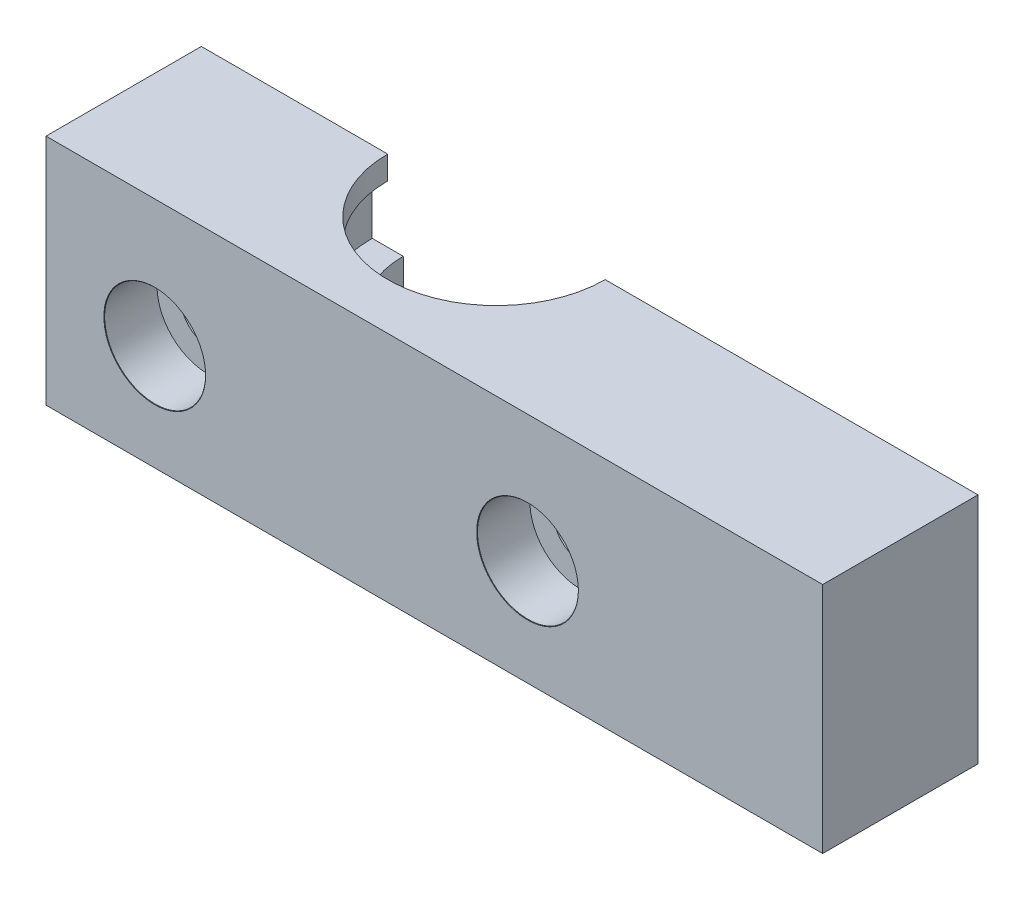
ISO-10303-21;
HEADER;
FILE_DESCRIPTION(('STEP AP214'),'2;1');
FILE_NAME('part.step','',(''),(''),'','','');
FILE_SCHEMA(('AUTOMOTIVE_DESIGN { 1 0 10303 214 1 1 1 1 }'));
ENDSEC;
DATA;
#1=APPLICATION_CONTEXT('core data for automotive mechanical design processes');
#2=APPLICATION_PROTOCOL_DEFINITION('international standard','automotive_design',2000,#1);
#3=PRODUCT_CONTEXT('',#1,'mechanical');
#4=PRODUCT('Part','Part','',(#3));
#5=PRODUCT_RELATED_PRODUCT_CATEGORY('part','',(#4));
#6=PRODUCT_DEFINITION_FORMATION('','',#4);
#7=PRODUCT_DEFINITION_CONTEXT('part definition',#1,'design');
#8=PRODUCT_DEFINITION('design','',#6,#7);
#9=PRODUCT_DEFINITION_SHAPE('','',#8);
#10=(LENGTH_UNIT() NAMED_UNIT(*) SI_UNIT(.MILLI.,.METRE.));
#11=(NAMED_UNIT(*) PLANE_ANGLE_UNIT() SI_UNIT($,.RADIAN.));
#12=(NAMED_UNIT(*) SI_UNIT($,.STERADIAN.) SOLID_ANGLE_UNIT());
#13=UNCERTAINTY_MEASURE_WITH_UNIT(LENGTH_MEASURE(1.E-05),#10,'distance_accuracy_value','');
#14=(GEOMETRIC_REPRESENTATION_CONTEXT(3) GLOBAL_UNCERTAINTY_ASSIGNED_CONTEXT((#13)) GLOBAL_UNIT_ASSIGNED_CONTEXT((#10,
#11,#12)) REPRESENTATION_CONTEXT('',''));
#15=CARTESIAN_POINT('',(0.,0.,0.));
#16=DIRECTION('',(0.,0.,1.));
#17=DIRECTION('',(1.,0.,0.));
#18=AXIS2_PLACEMENT_3D('',#15,#16,#17);
#19=CARTESIAN_POINT('',(0.,0.,0.));
#20=DIRECTION('',(0.,0.,-1.));
#21=DIRECTION('',(-1.,0.,0.));
#22=AXIS2_PLACEMENT_3D('',#19,#20,#21);
#23=PLANE('',#22);
#24=CARTESIAN_POINT('',(12.,8.8,0.));
#25=DIRECTION('',(0.,0.,1.));
#26=DIRECTION('',(1.,0.,0.));
#27=AXIS2_PLACEMENT_3D('',#24,#25,#26);
#28=CIRCLE('',#27,1.7);
#29=CARTESIAN_POINT('',(13.7,8.8,0.));
#30=VERTEX_POINT('',#29);
#31=EDGE_CURVE('E154',#30,#30,#28,.T.);
#32=ORIENTED_EDGE('',*,*,#31,.T.);
#33=EDGE_LOOP('',(#32));
#34=FACE_BOUND('',#33,.T.);
#35=DIRECTION('',(1.,0.,0.));
#36=VECTOR('',#35,1.);
#37=CARTESIAN_POINT('',(-19.,2.,0.));
#38=LINE('',#37,#36);
#39=CARTESIAN_POINT('',(6.25,2.,0.));
#40=VERTEX_POINT('',#39);
#41=CARTESIAN_POINT('',(31.,2.,0.));
#42=VERTEX_POINT('',#41);
#43=EDGE_CURVE('E250',#40,#42,#38,.T.);
#44=ORIENTED_EDGE('',*,*,#43,.F.);
#45=DIRECTION('',(0.,-1.,0.));
#46=VECTOR('',#45,1.);
#47=CARTESIAN_POINT('',(6.25,2.,0.));
#48=LINE('',#47,#46);
#49=CARTESIAN_POINT('',(6.25,2.8,0.));
#50=VERTEX_POINT('',#49);
#51=EDGE_CURVE('E11',#40,#50,#48,.F.);
#52=ORIENTED_EDGE('',*,*,#51,.T.);
#53=DIRECTION('',(1.,0.,0.));
#54=VECTOR('',#53,1.);
#55=CARTESIAN_POINT('',(0.,2.8,0.));
#56=LINE('',#55,#54);
#57=CARTESIAN_POINT('',(8.,2.8,0.));
#58=VERTEX_POINT('',#57);
#59=EDGE_CURVE('E47',#50,#58,#56,.T.);
#60=ORIENTED_EDGE('',*,*,#59,.T.);
#61=DIRECTION('',(0.,-1.,0.));
#62=VECTOR('',#61,1.);
#63=CARTESIAN_POINT('',(8.,2.,0.));
#64=LINE('',#63,#62);
#65=CARTESIAN_POINT('',(8.,5.8,0.));
#66=VERTEX_POINT('',#65);
#67=EDGE_CURVE('E215',#58,#66,#64,.F.);
#68=ORIENTED_EDGE('',*,*,#67,.T.);
#69=DIRECTION('',(-1.,0.,0.));
#70=VECTOR('',#69,1.);
#71=CARTESIAN_POINT('',(0.,5.8,0.));
#72=LINE('',#71,#70);
#73=CARTESIAN_POINT('',(6.,5.8,0.));
#74=VERTEX_POINT('',#73);
#75=EDGE_CURVE('E203',#66,#74,#72,.T.);
#76=ORIENTED_EDGE('',*,*,#75,.T.);
#77=DIRECTION('',(0.,-1.,0.));
#78=VECTOR('',#77,1.);
#79=CARTESIAN_POINT('',(6.,2.,0.));
#80=LINE('',#79,#78);
#81=CARTESIAN_POINT('',(6.,11.8,0.));
#82=VERTEX_POINT('',#81);
#83=EDGE_CURVE('E213',#74,#82,#80,.F.);
#84=ORIENTED_EDGE('',*,*,#83,.T.);
#85=DIRECTION('',(1.,0.,0.));
#86=VECTOR('',#85,1.);
#87=CARTESIAN_POINT('',(0.,11.8,0.));
#88=LINE('',#87,#86);
#89=CARTESIAN_POINT('',(8.,11.8,0.));
#90=VERTEX_POINT('',#89);
#91=EDGE_CURVE('E196',#82,#90,#88,.T.);
#92=ORIENTED_EDGE('',*,*,#91,.T.);
#93=DIRECTION('',(0.,-1.,0.));
#94=VECTOR('',#93,1.);
#95=CARTESIAN_POINT('',(8.,2.,0.));
#96=LINE('',#95,#94);
#97=CARTESIAN_POINT('',(8.,15.5,0.));
#98=VERTEX_POINT('',#97);
#99=EDGE_CURVE('E211',#90,#98,#96,.F.);
#100=ORIENTED_EDGE('',*,*,#99,.T.);
#101=DIRECTION('',(-1.,0.,0.));
#102=VECTOR('',#101,1.);
#103=CARTESIAN_POINT('',(0.,15.5,0.));
#104=LINE('',#103,#102);
#105=CARTESIAN_POINT('',(7.,15.5,0.));
#106=VERTEX_POINT('',#105);
#107=EDGE_CURVE('E163',#98,#106,#104,.T.);
#108=ORIENTED_EDGE('',*,*,#107,.T.);
#109=DIRECTION('',(0.,-1.,0.));
#110=VECTOR('',#109,1.);
#111=CARTESIAN_POINT('',(7.,2.,0.));
#112=LINE('',#111,#110);
#113=CARTESIAN_POINT('',(7.,17.,0.));
#114=VERTEX_POINT('',#113);
#115=EDGE_CURVE('E150',#106,#114,#112,.F.);
#116=ORIENTED_EDGE('',*,*,#115,.T.);
#117=DIRECTION('',(-1.,0.,0.));
#118=VECTOR('',#117,1.);
#119=CARTESIAN_POINT('',(-19.,17.,0.));
#120=LINE('',#119,#118);
#121=CARTESIAN_POINT('',(31.,17.,0.));
#122=VERTEX_POINT('',#121);
#123=EDGE_CURVE('E161',#122,#114,#120,.T.);
#124=ORIENTED_EDGE('',*,*,#123,.F.);
#125=DIRECTION('',(0.,1.,0.));
#126=VECTOR('',#125,1.);
#127=CARTESIAN_POINT('',(31.,2.,0.));
#128=LINE('',#127,#126);
#129=EDGE_CURVE('E173',#42,#122,#128,.T.);
#130=ORIENTED_EDGE('',*,*,#129,.F.);
#131=EDGE_LOOP('',(#44,#52,#60,#68,#76,#84,#92,#100,#108,#116,#124,#130));
#132=FACE_BOUND('',#131,.T.);
#133=ADVANCED_FACE('F39',(#34,#132),#23,.T.);
#134=CARTESIAN_POINT('',(-12.,8.8,0.));
#135=DIRECTION('',(0.,0.,1.));
#136=DIRECTION('',(1.,0.,0.));
#137=AXIS2_PLACEMENT_3D('',#134,#135,#136);
#138=CIRCLE('',#137,1.7);
#139=CARTESIAN_POINT('',(-10.3,8.8,0.));
#140=VERTEX_POINT('',#139);
#141=EDGE_CURVE('E297',#140,#140,#138,.T.);
#142=ORIENTED_EDGE('',*,*,#141,.T.);
#143=EDGE_LOOP('',(#142));
#144=FACE_BOUND('',#143,.T.);
#145=CARTESIAN_POINT('',(-8.,2.8,0.));
#146=VERTEX_POINT('',#145);
#147=CARTESIAN_POINT('',(-6.25,2.8,0.));
#148=VERTEX_POINT('',#147);
#149=EDGE_CURVE('E206',#146,#148,#56,.T.);
#150=ORIENTED_EDGE('',*,*,#149,.T.);
#151=DIRECTION('',(0.,-1.,0.));
#152=VECTOR('',#151,1.);
#153=CARTESIAN_POINT('',(-6.25,2.,0.));
#154=LINE('',#153,#152);
#155=CARTESIAN_POINT('',(-6.25,2.,0.));
#156=VERTEX_POINT('',#155);
#157=EDGE_CURVE('E164',#148,#156,#154,.T.);
#158=ORIENTED_EDGE('',*,*,#157,.T.);
#159=CARTESIAN_POINT('',(-19.,2.,0.));
#160=VERTEX_POINT('',#159);
#161=EDGE_CURVE('E251',#160,#156,#38,.T.);
#162=ORIENTED_EDGE('',*,*,#161,.F.);
#163=DIRECTION('',(0.,-1.,0.));
#164=VECTOR('',#163,1.);
#165=CARTESIAN_POINT('',(-19.,2.,0.));
#166=LINE('',#165,#164);
#167=CARTESIAN_POINT('',(-19.,17.,0.));
#168=VERTEX_POINT('',#167);
#169=EDGE_CURVE('E243',#168,#160,#166,.T.);
#170=ORIENTED_EDGE('',*,*,#169,.F.);
#171=CARTESIAN_POINT('',(-7.,17.,0.));
#172=VERTEX_POINT('',#171);
#173=EDGE_CURVE('E84',#172,#168,#120,.T.);
#174=ORIENTED_EDGE('',*,*,#173,.F.);
#175=DIRECTION('',(0.,-1.,0.));
#176=VECTOR('',#175,1.);
#177=CARTESIAN_POINT('',(-7.,2.,0.));
#178=LINE('',#177,#176);
#179=CARTESIAN_POINT('',(-7.,15.5,0.));
#180=VERTEX_POINT('',#179);
#181=EDGE_CURVE('E152',#172,#180,#178,.T.);
#182=ORIENTED_EDGE('',*,*,#181,.T.);
#183=CARTESIAN_POINT('',(-8.,15.5,0.));
#184=VERTEX_POINT('',#183);
#185=EDGE_CURVE('E186',#180,#184,#104,.T.);
#186=ORIENTED_EDGE('',*,*,#185,.T.);
#187=DIRECTION('',(0.,-1.,0.));
#188=VECTOR('',#187,1.);
#189=CARTESIAN_POINT('',(-8.,2.,0.));
#190=LINE('',#189,#188);
#191=CARTESIAN_POINT('',(-8.,11.8,0.));
#192=VERTEX_POINT('',#191);
#193=EDGE_CURVE('E189',#184,#192,#190,.T.);
#194=ORIENTED_EDGE('',*,*,#193,.T.);
#195=CARTESIAN_POINT('',(-6.,11.8,0.));
#196=VERTEX_POINT('',#195);
#197=EDGE_CURVE('E192',#192,#196,#88,.T.);
#198=ORIENTED_EDGE('',*,*,#197,.T.);
#199=DIRECTION('',(0.,-1.,0.));
#200=VECTOR('',#199,1.);
#201=CARTESIAN_POINT('',(-6.,2.,0.));
#202=LINE('',#201,#200);
#203=CARTESIAN_POINT('',(-6.,5.8,0.));
#204=VERTEX_POINT('',#203);
#205=EDGE_CURVE('E195',#196,#204,#202,.T.);
#206=ORIENTED_EDGE('',*,*,#205,.T.);
#207=CARTESIAN_POINT('',(-8.,5.8,0.));
#208=VERTEX_POINT('',#207);
#209=EDGE_CURVE('E199',#204,#208,#72,.T.);
#210=ORIENTED_EDGE('',*,*,#209,.T.);
#211=DIRECTION('',(0.,-1.,0.));
#212=VECTOR('',#211,1.);
#213=CARTESIAN_POINT('',(-8.,2.,0.));
#214=LINE('',#213,#212);
#215=EDGE_CURVE('E202',#208,#146,#214,.T.);
#216=ORIENTED_EDGE('',*,*,#215,.T.);
#217=EDGE_LOOP('',(#150,#158,#162,#170,#174,#182,#186,#194,#198,#206,#210,#216));
#218=FACE_BOUND('',#217,.T.);
#219=ADVANCED_FACE('F264',(#144,#218),#23,.T.);
#220=CARTESIAN_POINT('',(-19.,2.,10.));
#221=DIRECTION('',(1.,0.,0.));
#222=DIRECTION('',(0.,0.,-1.));
#223=AXIS2_PLACEMENT_3D('',#220,#221,#222);
#224=PLANE('',#223);
#225=ORIENTED_EDGE('',*,*,#169,.T.);
#226=DIRECTION('',(0.,0.,-1.));
#227=VECTOR('',#226,1.);
#228=CARTESIAN_POINT('',(-19.,2.,10.));
#229=LINE('',#228,#227);
#230=CARTESIAN_POINT('',(-19.,2.,10.));
#231=VERTEX_POINT('',#230);
#232=EDGE_CURVE('E183',#231,#160,#229,.T.);
#233=ORIENTED_EDGE('',*,*,#232,.F.);
#234=DIRECTION('',(0.,-1.,0.));
#235=VECTOR('',#234,1.);
#236=CARTESIAN_POINT('',(-19.,2.,10.));
#237=LINE('',#236,#235);
#238=CARTESIAN_POINT('',(-19.,17.,10.));
#239=VERTEX_POINT('',#238);
#240=EDGE_CURVE('E170',#239,#231,#237,.T.);
#241=ORIENTED_EDGE('',*,*,#240,.F.);
#242=DIRECTION('',(0.,0.,-1.));
#243=VECTOR('',#242,1.);
#244=CARTESIAN_POINT('',(-19.,17.,10.));
#245=LINE('',#244,#243);
#246=EDGE_CURVE('E177',#239,#168,#245,.T.);
#247=ORIENTED_EDGE('',*,*,#246,.T.);
#248=EDGE_LOOP('',(#225,#233,#241,#247));
#249=FACE_BOUND('',#248,.T.);
#250=ADVANCED_FACE('F41',(#249),#224,.F.);
#251=CARTESIAN_POINT('',(-19.,2.,10.));
#252=DIRECTION('',(0.,1.,0.));
#253=DIRECTION('',(0.,0.,1.));
#254=AXIS2_PLACEMENT_3D('',#251,#252,#253);
#255=PLANE('',#254);
#256=CARTESIAN_POINT('',(0.,2.,0.));
#257=DIRECTION('',(0.,-1.,0.));
#258=DIRECTION('',(0.,0.,-1.));
#259=AXIS2_PLACEMENT_3D('',#256,#257,#258);
#260=CIRCLE('',#259,6.25);
#261=EDGE_CURVE('E242',#40,#156,#260,.T.);
#262=ORIENTED_EDGE('',*,*,#261,.F.);
#263=ORIENTED_EDGE('',*,*,#43,.T.);
#264=DIRECTION('',(0.,0.,-1.));
#265=VECTOR('',#264,1.);
#266=CARTESIAN_POINT('',(31.,2.,10.));
#267=LINE('',#266,#265);
#268=CARTESIAN_POINT('',(31.,2.,10.));
#269=VERTEX_POINT('',#268);
#270=EDGE_CURVE('E180',#269,#42,#267,.T.);
#271=ORIENTED_EDGE('',*,*,#270,.F.);
#272=DIRECTION('',(1.,0.,0.));
#273=VECTOR('',#272,1.);
#274=CARTESIAN_POINT('',(-19.,2.,10.));
#275=LINE('',#274,#273);
#276=EDGE_CURVE('E92',#231,#269,#275,.T.);
#277=ORIENTED_EDGE('',*,*,#276,.F.);
#278=ORIENTED_EDGE('',*,*,#232,.T.);
#279=ORIENTED_EDGE('',*,*,#161,.T.);
#280=EDGE_LOOP('',(#262,#263,#271,#277,#278,#279));
#281=FACE_BOUND('',#280,.T.);
#282=ADVANCED_FACE('F254',(#281),#255,.F.);
#283=CARTESIAN_POINT('',(31.,2.,10.));
#284=DIRECTION('',(-1.,0.,0.));
#285=DIRECTION('',(0.,0.,1.));
#286=AXIS2_PLACEMENT_3D('',#283,#284,#285);
#287=PLANE('',#286);
#288=ORIENTED_EDGE('',*,*,#129,.T.);
#289=DIRECTION('',(0.,0.,-1.));
#290=VECTOR('',#289,1.);
#291=CARTESIAN_POINT('',(31.,17.,10.));
#292=LINE('',#291,#290);
#293=CARTESIAN_POINT('',(31.,17.,10.));
#294=VERTEX_POINT('',#293);
#295=EDGE_CURVE('E169',#294,#122,#292,.T.);
#296=ORIENTED_EDGE('',*,*,#295,.F.);
#297=DIRECTION('',(0.,1.,0.));
#298=VECTOR('',#297,1.);
#299=CARTESIAN_POINT('',(31.,2.,10.));
#300=LINE('',#299,#298);
#301=EDGE_CURVE('E246',#269,#294,#300,.T.);
#302=ORIENTED_EDGE('',*,*,#301,.F.);
#303=ORIENTED_EDGE('',*,*,#270,.T.);
#304=EDGE_LOOP('',(#288,#296,#302,#303));
#305=FACE_BOUND('',#304,.T.);
#306=ADVANCED_FACE('F257',(#305),#287,.F.);
#307=CARTESIAN_POINT('',(-19.,17.,10.));
#308=DIRECTION('',(0.,-1.,0.));
#309=DIRECTION('',(0.,0.,-1.));
#310=AXIS2_PLACEMENT_3D('',#307,#308,#309);
#311=PLANE('',#310);
#312=CARTESIAN_POINT('',(0.,17.,0.));
#313=DIRECTION('',(0.,-1.,0.));
#314=DIRECTION('',(0.,0.,-1.));
#315=AXIS2_PLACEMENT_3D('',#312,#313,#314);
#316=CIRCLE('',#315,7.);
#317=EDGE_CURVE('E147',#114,#172,#316,.T.);
#318=ORIENTED_EDGE('',*,*,#317,.T.);
#319=ORIENTED_EDGE('',*,*,#173,.T.);
#320=ORIENTED_EDGE('',*,*,#246,.F.);
#321=DIRECTION('',(-1.,0.,0.));
#322=VECTOR('',#321,1.);
#323=CARTESIAN_POINT('',(-19.,17.,10.));
#324=LINE('',#323,#322);
#325=EDGE_CURVE('E63',#294,#239,#324,.T.);
#326=ORIENTED_EDGE('',*,*,#325,.F.);
#327=ORIENTED_EDGE('',*,*,#295,.T.);
#328=ORIENTED_EDGE('',*,*,#123,.T.);
#329=EDGE_LOOP('',(#318,#319,#320,#326,#327,#328));
#330=FACE_BOUND('',#329,.T.);
#331=ADVANCED_FACE('F167',(#330),#311,.F.);
#332=CARTESIAN_POINT('',(0.,0.,10.));
#333=DIRECTION('',(0.,0.,-1.));
#334=DIRECTION('',(-1.,0.,0.));
#335=AXIS2_PLACEMENT_3D('',#332,#333,#334);
#336=PLANE('',#335);
#337=CARTESIAN_POINT('',(-12.,8.8,10.));
#338=DIRECTION('',(0.,0.,1.));
#339=DIRECTION('',(1.,0.,0.));
#340=AXIS2_PLACEMENT_3D('',#337,#338,#339);
#341=CIRCLE('',#340,3.275);
#342=CARTESIAN_POINT('',(-8.725,8.8,10.));
#343=VERTEX_POINT('',#342);
#344=EDGE_CURVE('E309',#343,#343,#341,.T.);
#345=ORIENTED_EDGE('',*,*,#344,.F.);
#346=EDGE_LOOP('',(#345));
#347=FACE_BOUND('',#346,.T.);
#348=CARTESIAN_POINT('',(12.,8.8,10.));
#349=DIRECTION('',(0.,0.,1.));
#350=DIRECTION('',(1.,0.,0.));
#351=AXIS2_PLACEMENT_3D('',#348,#349,#350);
#352=CIRCLE('',#351,3.275);
#353=CARTESIAN_POINT('',(15.275,8.8,10.));
#354=VERTEX_POINT('',#353);
#355=EDGE_CURVE('E294',#354,#354,#352,.T.);
#356=ORIENTED_EDGE('',*,*,#355,.F.);
#357=EDGE_LOOP('',(#356));
#358=FACE_BOUND('',#357,.T.);
#359=ORIENTED_EDGE('',*,*,#240,.T.);
#360=ORIENTED_EDGE('',*,*,#276,.T.);
#361=ORIENTED_EDGE('',*,*,#301,.T.);
#362=ORIENTED_EDGE('',*,*,#325,.T.);
#363=EDGE_LOOP('',(#359,#360,#361,#362));
#364=FACE_BOUND('',#363,.T.);
#365=ADVANCED_FACE('F258',(#347,#358,#364),#336,.F.);
#366=CARTESIAN_POINT('',(0.,2.,0.));
#367=DIRECTION('',(0.,-1.,0.));
#368=DIRECTION('',(0.,0.,-1.));
#369=AXIS2_PLACEMENT_3D('',#366,#367,#368);
#370=CYLINDRICAL_SURFACE('',#369,6.25);
#371=ORIENTED_EDGE('',*,*,#261,.T.);
#372=ORIENTED_EDGE('',*,*,#157,.F.);
#373=CARTESIAN_POINT('',(0.,2.8,0.));
#374=DIRECTION('',(0.,-1.,0.));
#375=DIRECTION('',(0.,0.,-1.));
#376=AXIS2_PLACEMENT_3D('',#373,#374,#375);
#377=CIRCLE('',#376,6.25);
#378=EDGE_CURVE('E234',#50,#148,#377,.T.);
#379=ORIENTED_EDGE('',*,*,#378,.F.);
#380=ORIENTED_EDGE('',*,*,#51,.F.);
#381=EDGE_LOOP('',(#371,#372,#379,#380));
#382=FACE_BOUND('',#381,.T.);
#383=ADVANCED_FACE('F267',(#382),#370,.F.);
#384=CARTESIAN_POINT('',(0.,2.8,8.));
#385=DIRECTION('',(0.,1.,0.));
#386=DIRECTION('',(0.,0.,1.));
#387=AXIS2_PLACEMENT_3D('',#384,#385,#386);
#388=PLANE('',#387);
#389=CARTESIAN_POINT('',(0.,2.8,0.));
#390=DIRECTION('',(0.,-1.,0.));
#391=DIRECTION('',(0.,0.,-1.));
#392=AXIS2_PLACEMENT_3D('',#389,#390,#391);
#393=CIRCLE('',#392,8.);
#394=EDGE_CURVE('E232',#58,#146,#393,.T.);
#395=ORIENTED_EDGE('',*,*,#394,.F.);
#396=ORIENTED_EDGE('',*,*,#59,.F.);
#397=ORIENTED_EDGE('',*,*,#378,.T.);
#398=ORIENTED_EDGE('',*,*,#149,.F.);
#399=EDGE_LOOP('',(#395,#396,#397,#398));
#400=FACE_BOUND('',#399,.T.);
#401=ADVANCED_FACE('F269',(#400),#388,.T.);
#402=CARTESIAN_POINT('',(0.,2.,0.));
#403=DIRECTION('',(0.,-1.,0.));
#404=DIRECTION('',(0.,0.,-1.));
#405=AXIS2_PLACEMENT_3D('',#402,#403,#404);
#406=CYLINDRICAL_SURFACE('',#405,8.);
#407=ORIENTED_EDGE('',*,*,#394,.T.);
#408=ORIENTED_EDGE('',*,*,#215,.F.);
#409=CARTESIAN_POINT('',(0.,5.8,0.));
#410=DIRECTION('',(0.,-1.,0.));
#411=DIRECTION('',(0.,0.,-1.));
#412=AXIS2_PLACEMENT_3D('',#409,#410,#411);
#413=CIRCLE('',#412,8.);
#414=EDGE_CURVE('E225',#66,#208,#413,.T.);
#415=ORIENTED_EDGE('',*,*,#414,.F.);
#416=ORIENTED_EDGE('',*,*,#67,.F.);
#417=EDGE_LOOP('',(#407,#408,#415,#416));
#418=FACE_BOUND('',#417,.T.);
#419=ADVANCED_FACE('F230',(#418),#406,.F.);
#420=CARTESIAN_POINT('',(0.,5.8,6.));
#421=DIRECTION('',(0.,-1.,0.));
#422=DIRECTION('',(0.,0.,-1.));
#423=AXIS2_PLACEMENT_3D('',#420,#421,#422);
#424=PLANE('',#423);
#425=ORIENTED_EDGE('',*,*,#414,.T.);
#426=ORIENTED_EDGE('',*,*,#209,.F.);
#427=CARTESIAN_POINT('',(0.,5.8,0.));
#428=DIRECTION('',(0.,-1.,0.));
#429=DIRECTION('',(0.,0.,-1.));
#430=AXIS2_PLACEMENT_3D('',#427,#428,#429);
#431=CIRCLE('',#430,6.);
#432=EDGE_CURVE('E227',#74,#204,#431,.T.);
#433=ORIENTED_EDGE('',*,*,#432,.F.);
#434=ORIENTED_EDGE('',*,*,#75,.F.);
#435=EDGE_LOOP('',(#425,#426,#433,#434));
#436=FACE_BOUND('',#435,.T.);
#437=ADVANCED_FACE('F224',(#436),#424,.T.);
#438=CARTESIAN_POINT('',(0.,2.,0.));
#439=DIRECTION('',(0.,-1.,0.));
#440=DIRECTION('',(0.,0.,-1.));
#441=AXIS2_PLACEMENT_3D('',#438,#439,#440);
#442=CYLINDRICAL_SURFACE('',#441,6.);
#443=ORIENTED_EDGE('',*,*,#432,.T.);
#444=ORIENTED_EDGE('',*,*,#205,.F.);
#445=CARTESIAN_POINT('',(0.,11.8,0.));
#446=DIRECTION('',(0.,-1.,0.));
#447=DIRECTION('',(0.,0.,-1.));
#448=AXIS2_PLACEMENT_3D('',#445,#446,#447);
#449=CIRCLE('',#448,6.);
#450=EDGE_CURVE('E236',#82,#196,#449,.T.);
#451=ORIENTED_EDGE('',*,*,#450,.F.);
#452=ORIENTED_EDGE('',*,*,#83,.F.);
#453=EDGE_LOOP('',(#443,#444,#451,#452));
#454=FACE_BOUND('',#453,.T.);
#455=ADVANCED_FACE('F271',(#454),#442,.F.);
#456=CARTESIAN_POINT('',(0.,11.8,8.));
#457=DIRECTION('',(0.,1.,0.));
#458=DIRECTION('',(0.,0.,1.));
#459=AXIS2_PLACEMENT_3D('',#456,#457,#458);
#460=PLANE('',#459);
#461=CARTESIAN_POINT('',(0.,11.8,0.));
#462=DIRECTION('',(0.,-1.,0.));
#463=DIRECTION('',(0.,0.,-1.));
#464=AXIS2_PLACEMENT_3D('',#461,#462,#463);
#465=CIRCLE('',#464,8.);
#466=EDGE_CURVE('E275',#90,#192,#465,.T.);
#467=ORIENTED_EDGE('',*,*,#466,.F.);
#468=ORIENTED_EDGE('',*,*,#91,.F.);
#469=ORIENTED_EDGE('',*,*,#450,.T.);
#470=ORIENTED_EDGE('',*,*,#197,.F.);
#471=EDGE_LOOP('',(#467,#468,#469,#470));
#472=FACE_BOUND('',#471,.T.);
#473=ADVANCED_FACE('F457',(#472),#460,.T.);
#474=CARTESIAN_POINT('',(0.,2.,0.));
#475=DIRECTION('',(0.,-1.,0.));
#476=DIRECTION('',(0.,0.,-1.));
#477=AXIS2_PLACEMENT_3D('',#474,#475,#476);
#478=CYLINDRICAL_SURFACE('',#477,8.);
#479=ORIENTED_EDGE('',*,*,#466,.T.);
#480=ORIENTED_EDGE('',*,*,#193,.F.);
#481=CARTESIAN_POINT('',(0.,15.5,0.));
#482=DIRECTION('',(0.,-1.,0.));
#483=DIRECTION('',(0.,0.,-1.));
#484=AXIS2_PLACEMENT_3D('',#481,#482,#483);
#485=CIRCLE('',#484,8.);
#486=EDGE_CURVE('E277',#98,#184,#485,.T.);
#487=ORIENTED_EDGE('',*,*,#486,.F.);
#488=ORIENTED_EDGE('',*,*,#99,.F.);
#489=EDGE_LOOP('',(#479,#480,#487,#488));
#490=FACE_BOUND('',#489,.T.);
#491=ADVANCED_FACE('F453',(#490),#478,.F.);
#492=CARTESIAN_POINT('',(0.,15.5,7.));
#493=DIRECTION('',(0.,-1.,0.));
#494=DIRECTION('',(0.,0.,-1.));
#495=AXIS2_PLACEMENT_3D('',#492,#493,#494);
#496=PLANE('',#495);
#497=ORIENTED_EDGE('',*,*,#486,.T.);
#498=ORIENTED_EDGE('',*,*,#185,.F.);
#499=CARTESIAN_POINT('',(0.,15.5,0.));
#500=DIRECTION('',(0.,-1.,0.));
#501=DIRECTION('',(0.,0.,-1.));
#502=AXIS2_PLACEMENT_3D('',#499,#500,#501);
#503=CIRCLE('',#502,7.);
#504=EDGE_CURVE('E54',#106,#180,#503,.T.);
#505=ORIENTED_EDGE('',*,*,#504,.F.);
#506=ORIENTED_EDGE('',*,*,#107,.F.);
#507=EDGE_LOOP('',(#497,#498,#505,#506));
#508=FACE_BOUND('',#507,.T.);
#509=ADVANCED_FACE('F450',(#508),#496,.T.);
#510=CARTESIAN_POINT('',(0.,2.,0.));
#511=DIRECTION('',(0.,-1.,0.));
#512=DIRECTION('',(0.,0.,-1.));
#513=AXIS2_PLACEMENT_3D('',#510,#511,#512);
#514=CYLINDRICAL_SURFACE('',#513,7.);
#515=ORIENTED_EDGE('',*,*,#504,.T.);
#516=ORIENTED_EDGE('',*,*,#181,.F.);
#517=ORIENTED_EDGE('',*,*,#317,.F.);
#518=ORIENTED_EDGE('',*,*,#115,.F.);
#519=EDGE_LOOP('',(#515,#516,#517,#518));
#520=FACE_BOUND('',#519,.T.);
#521=ADVANCED_FACE('F149',(#520),#514,.F.);
#522=CARTESIAN_POINT('',(12.,8.8,10.));
#523=DIRECTION('',(0.,0.,1.));
#524=DIRECTION('',(1.,0.,0.));
#525=AXIS2_PLACEMENT_3D('',#522,#523,#524);
#526=CYLINDRICAL_SURFACE('',#525,1.7);
#527=ORIENTED_EDGE('',*,*,#31,.F.);
#528=EDGE_LOOP('',(#527));
#529=FACE_BOUND('',#528,.T.);
#530=CARTESIAN_POINT('',(12.,8.8,6.6));
#531=DIRECTION('',(0.,0.,1.));
#532=DIRECTION('',(1.,0.,0.));
#533=AXIS2_PLACEMENT_3D('',#530,#531,#532);
#534=CIRCLE('',#533,1.7);
#535=CARTESIAN_POINT('',(13.7,8.8,6.6));
#536=VERTEX_POINT('',#535);
#537=EDGE_CURVE('E285',#536,#536,#534,.T.);
#538=ORIENTED_EDGE('',*,*,#537,.T.);
#539=EDGE_LOOP('',(#538));
#540=FACE_BOUND('',#539,.T.);
#541=ADVANCED_FACE('F376',(#529,#540),#526,.F.);
#542=CARTESIAN_POINT('',(15.25,8.8,6.6));
#543=DIRECTION('',(0.,0.,-1.));
#544=DIRECTION('',(-1.,0.,0.));
#545=AXIS2_PLACEMENT_3D('',#542,#543,#544);
#546=PLANE('',#545);
#547=ORIENTED_EDGE('',*,*,#537,.F.);
#548=EDGE_LOOP('',(#547));
#549=FACE_BOUND('',#548,.T.);
#550=CARTESIAN_POINT('',(12.,8.8,6.6));
#551=DIRECTION('',(0.,0.,1.));
#552=DIRECTION('',(1.,0.,0.));
#553=AXIS2_PLACEMENT_3D('',#550,#551,#552);
#554=CIRCLE('',#553,3.25);
#555=CARTESIAN_POINT('',(15.25,8.8,6.6));
#556=VERTEX_POINT('',#555);
#557=EDGE_CURVE('E288',#556,#556,#554,.T.);
#558=ORIENTED_EDGE('',*,*,#557,.T.);
#559=EDGE_LOOP('',(#558));
#560=FACE_BOUND('',#559,.T.);
#561=ADVANCED_FACE('F333',(#549,#560),#546,.F.);
#562=CARTESIAN_POINT('',(12.,8.8,10.));
#563=DIRECTION('',(0.,0.,1.));
#564=DIRECTION('',(1.,0.,0.));
#565=AXIS2_PLACEMENT_3D('',#562,#563,#564);
#566=CYLINDRICAL_SURFACE('',#565,3.25);
#567=ORIENTED_EDGE('',*,*,#557,.F.);
#568=EDGE_LOOP('',(#567));
#569=FACE_BOUND('',#568,.T.);
#570=CARTESIAN_POINT('',(12.,8.8,9.975));
#571=DIRECTION('',(0.,0.,1.));
#572=DIRECTION('',(1.,0.,0.));
#573=AXIS2_PLACEMENT_3D('',#570,#571,#572);
#574=CIRCLE('',#573,3.25);
#575=CARTESIAN_POINT('',(15.25,8.8,9.975));
#576=VERTEX_POINT('',#575);
#577=EDGE_CURVE('E291',#576,#576,#574,.T.);
#578=ORIENTED_EDGE('',*,*,#577,.T.);
#579=EDGE_LOOP('',(#578));
#580=FACE_BOUND('',#579,.T.);
#581=ADVANCED_FACE('F323',(#569,#580),#566,.F.);
#582=CARTESIAN_POINT('',(12.,8.8,10.));
#583=DIRECTION('',(0.,0.,1.));
#584=DIRECTION('',(1.,0.,0.));
#585=AXIS2_PLACEMENT_3D('',#582,#583,#584);
#586=CONICAL_SURFACE('',#585,3.275,0.785398163397414);
#587=ORIENTED_EDGE('',*,*,#577,.F.);
#588=EDGE_LOOP('',(#587));
#589=FACE_BOUND('',#588,.T.);
#590=ORIENTED_EDGE('',*,*,#355,.T.);
#591=EDGE_LOOP('',(#590));
#592=FACE_BOUND('',#591,.T.);
#593=ADVANCED_FACE('F320',(#589,#592),#586,.F.);
#594=CARTESIAN_POINT('',(-12.,8.8,10.));
#595=DIRECTION('',(0.,0.,1.));
#596=DIRECTION('',(1.,0.,0.));
#597=AXIS2_PLACEMENT_3D('',#594,#595,#596);
#598=CYLINDRICAL_SURFACE('',#597,1.7);
#599=ORIENTED_EDGE('',*,*,#141,.F.);
#600=EDGE_LOOP('',(#599));
#601=FACE_BOUND('',#600,.T.);
#602=CARTESIAN_POINT('',(-12.,8.8,6.6));
#603=DIRECTION('',(0.,0.,1.));
#604=DIRECTION('',(1.,0.,0.));
#605=AXIS2_PLACEMENT_3D('',#602,#603,#604);
#606=CIRCLE('',#605,1.7);
#607=CARTESIAN_POINT('',(-10.3,8.8,6.6));
#608=VERTEX_POINT('',#607);
#609=EDGE_CURVE('E300',#608,#608,#606,.T.);
#610=ORIENTED_EDGE('',*,*,#609,.T.);
#611=EDGE_LOOP('',(#610));
#612=FACE_BOUND('',#611,.T.);
#613=ADVANCED_FACE('F322',(#601,#612),#598,.F.);
#614=CARTESIAN_POINT('',(-8.75,8.8,6.6));
#615=DIRECTION('',(0.,0.,-1.));
#616=DIRECTION('',(-1.,0.,0.));
#617=AXIS2_PLACEMENT_3D('',#614,#615,#616);
#618=PLANE('',#617);
#619=ORIENTED_EDGE('',*,*,#609,.F.);
#620=EDGE_LOOP('',(#619));
#621=FACE_BOUND('',#620,.T.);
#622=CARTESIAN_POINT('',(-12.,8.8,6.6));
#623=DIRECTION('',(0.,0.,1.));
#624=DIRECTION('',(1.,0.,0.));
#625=AXIS2_PLACEMENT_3D('',#622,#623,#624);
#626=CIRCLE('',#625,3.25);
#627=CARTESIAN_POINT('',(-8.75,8.8,6.6));
#628=VERTEX_POINT('',#627);
#629=EDGE_CURVE('E303',#628,#628,#626,.T.);
#630=ORIENTED_EDGE('',*,*,#629,.T.);
#631=EDGE_LOOP('',(#630));
#632=FACE_BOUND('',#631,.T.);
#633=ADVANCED_FACE('F330',(#621,#632),#618,.F.);
#634=CARTESIAN_POINT('',(-12.,8.8,10.));
#635=DIRECTION('',(0.,0.,1.));
#636=DIRECTION('',(1.,0.,0.));
#637=AXIS2_PLACEMENT_3D('',#634,#635,#636);
#638=CYLINDRICAL_SURFACE('',#637,3.25);
#639=ORIENTED_EDGE('',*,*,#629,.F.);
#640=EDGE_LOOP('',(#639));
#641=FACE_BOUND('',#640,.T.);
#642=CARTESIAN_POINT('',(-12.,8.8,9.975));
#643=DIRECTION('',(0.,0.,1.));
#644=DIRECTION('',(1.,0.,0.));
#645=AXIS2_PLACEMENT_3D('',#642,#643,#644);
#646=CIRCLE('',#645,3.25);
#647=CARTESIAN_POINT('',(-8.75,8.8,9.975));
#648=VERTEX_POINT('',#647);
#649=EDGE_CURVE('E306',#648,#648,#646,.T.);
#650=ORIENTED_EDGE('',*,*,#649,.T.);
#651=EDGE_LOOP('',(#650));
#652=FACE_BOUND('',#651,.T.);
#653=ADVANCED_FACE('F417',(#641,#652),#638,.F.);
#654=CARTESIAN_POINT('',(-12.,8.8,10.));
#655=DIRECTION('',(0.,0.,1.));
#656=DIRECTION('',(1.,0.,0.));
#657=AXIS2_PLACEMENT_3D('',#654,#655,#656);
#658=CONICAL_SURFACE('',#657,3.275,0.785398163397414);
#659=ORIENTED_EDGE('',*,*,#649,.F.);
#660=EDGE_LOOP('',(#659));
#661=FACE_BOUND('',#660,.T.);
#662=ORIENTED_EDGE('',*,*,#344,.T.);
#663=EDGE_LOOP('',(#662));
#664=FACE_BOUND('',#663,.T.);
#665=ADVANCED_FACE('F313',(#661,#664),#658,.F.);
#666=CLOSED_SHELL('',(#133,#219,#250,#282,#306,#331,#365,#383,#401,#419,#437,#455,#473,#491,
#509,#521,#541,#561,#581,#593,#613,#633,#653,#665));
#667=MANIFOLD_SOLID_BREP('B2',#666);
#668=ADVANCED_BREP_SHAPE_REPRESENTATION('',(#18,#667),#14);
#669=SHAPE_DEFINITION_REPRESENTATION(#9,#668);
ENDSEC;
END-ISO-10303-21;
